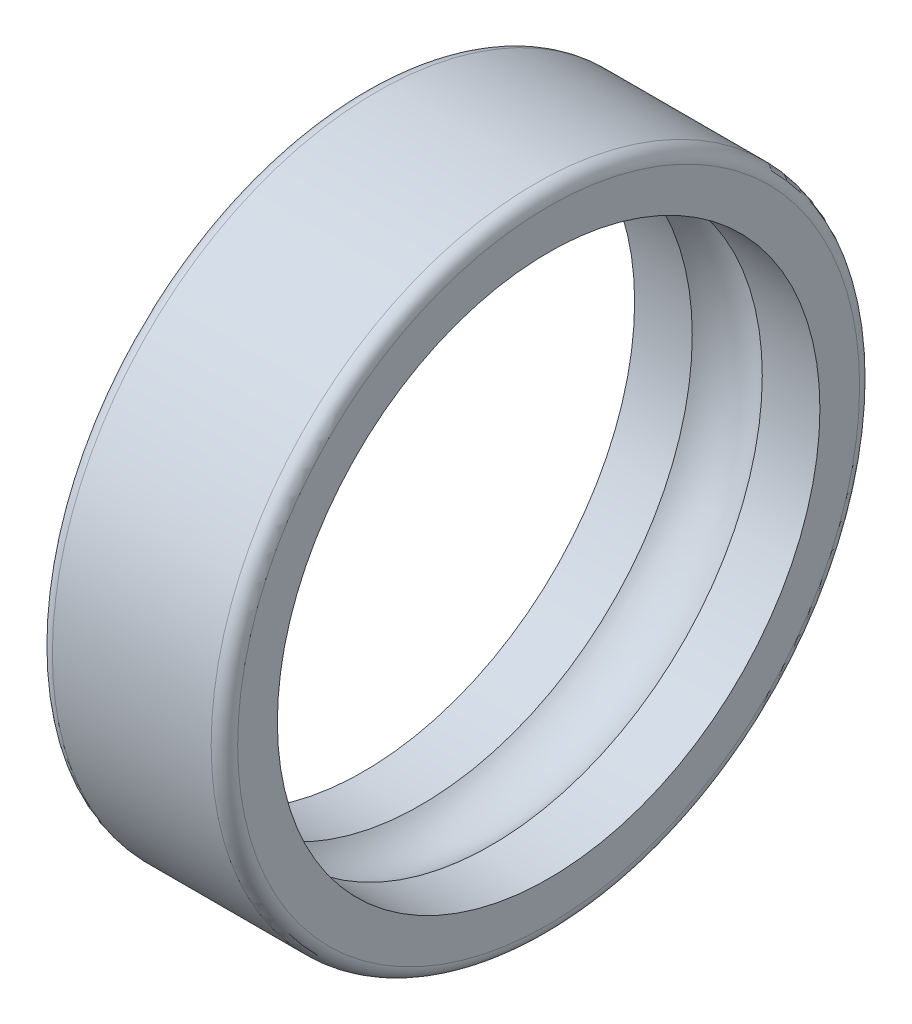
ISO-10303-21;
HEADER;
FILE_DESCRIPTION(('STEP AP214'),'2;1');
FILE_NAME('part.step','',(''),(''),'','','');
FILE_SCHEMA(('AUTOMOTIVE_DESIGN { 1 0 10303 214 1 1 1 1 }'));
ENDSEC;
DATA;
#1=APPLICATION_CONTEXT('core data for automotive mechanical design processes');
#2=APPLICATION_PROTOCOL_DEFINITION('international standard','automotive_design',2000,#1);
#3=PRODUCT_CONTEXT('',#1,'mechanical');
#4=PRODUCT('Part','Part','',(#3));
#5=PRODUCT_RELATED_PRODUCT_CATEGORY('part','',(#4));
#6=PRODUCT_DEFINITION_FORMATION('','',#4);
#7=PRODUCT_DEFINITION_CONTEXT('part definition',#1,'design');
#8=PRODUCT_DEFINITION('design','',#6,#7);
#9=PRODUCT_DEFINITION_SHAPE('','',#8);
#10=(LENGTH_UNIT() NAMED_UNIT(*) SI_UNIT(.MILLI.,.METRE.));
#11=(NAMED_UNIT(*) PLANE_ANGLE_UNIT() SI_UNIT($,.RADIAN.));
#12=(NAMED_UNIT(*) SI_UNIT($,.STERADIAN.) SOLID_ANGLE_UNIT());
#13=UNCERTAINTY_MEASURE_WITH_UNIT(LENGTH_MEASURE(1.E-05),#10,'distance_accuracy_value','');
#14=(GEOMETRIC_REPRESENTATION_CONTEXT(3) GLOBAL_UNCERTAINTY_ASSIGNED_CONTEXT((#13)) GLOBAL_UNIT_ASSIGNED_CONTEXT((#10,
#11,#12)) REPRESENTATION_CONTEXT('',''));
#15=CARTESIAN_POINT('',(0.,0.,0.));
#16=DIRECTION('',(0.,0.,1.));
#17=DIRECTION('',(1.,0.,0.));
#18=AXIS2_PLACEMENT_3D('',#15,#16,#17);
#19=CARTESIAN_POINT('',(0.,0.,0.));
#20=DIRECTION('',(-1.,0.,0.));
#21=DIRECTION('',(0.,0.,1.));
#22=AXIS2_PLACEMENT_3D('',#19,#20,#21);
#23=CYLINDRICAL_SURFACE('',#22,11.7142857142857);
#24=CARTESIAN_POINT('',(4.,0.,0.));
#25=DIRECTION('',(-1.,0.,0.));
#26=DIRECTION('',(0.,0.,1.));
#27=AXIS2_PLACEMENT_3D('',#24,#25,#26);
#28=CIRCLE('',#27,11.7142857142857);
#29=CARTESIAN_POINT('',(4.,0.,11.7142857142857));
#30=VERTEX_POINT('',#29);
#31=EDGE_CURVE('E376',#30,#30,#28,.T.);
#32=ORIENTED_EDGE('',*,*,#31,.F.);
#33=EDGE_LOOP('',(#32));
#34=FACE_BOUND('',#33,.T.);
#35=CARTESIAN_POINT('',(1.51185789203691,0.,0.));
#36=DIRECTION('',(-1.,0.,0.));
#37=DIRECTION('',(0.,0.,1.));
#38=AXIS2_PLACEMENT_3D('',#35,#36,#37);
#39=CIRCLE('',#38,11.7142857142857);
#40=CARTESIAN_POINT('',(1.51185789203691,0.,11.7142857142857));
#41=VERTEX_POINT('',#40);
#42=EDGE_CURVE('E10',#41,#41,#39,.T.);
#43=ORIENTED_EDGE('',*,*,#42,.T.);
#44=EDGE_LOOP('',(#43));
#45=FACE_BOUND('',#44,.T.);
#46=ADVANCED_FACE('F348',(#34,#45),#23,.F.);
#47=CARTESIAN_POINT('',(0.,0.,0.));
#48=DIRECTION('',(-1.,0.,0.));
#49=DIRECTION('',(0.,0.,1.));
#50=AXIS2_PLACEMENT_3D('',#47,#48,#49);
#51=TOROIDAL_SURFACE('',#50,10.,2.28571428571429);
#52=ORIENTED_EDGE('',*,*,#42,.F.);
#53=EDGE_LOOP('',(#52));
#54=FACE_BOUND('',#53,.T.);
#55=CARTESIAN_POINT('',(-1.51185789203691,0.,0.));
#56=DIRECTION('',(-1.,0.,0.));
#57=DIRECTION('',(0.,0.,1.));
#58=AXIS2_PLACEMENT_3D('',#55,#56,#57);
#59=CIRCLE('',#58,11.7142857142857);
#60=CARTESIAN_POINT('',(-1.51185789203691,0.,11.7142857142857));
#61=VERTEX_POINT('',#60);
#62=EDGE_CURVE('E354',#61,#61,#59,.T.);
#63=ORIENTED_EDGE('',*,*,#62,.T.);
#64=EDGE_LOOP('',(#63));
#65=FACE_BOUND('',#64,.T.);
#66=ADVANCED_FACE('F383',(#54,#65),#51,.F.);
#67=CARTESIAN_POINT('',(0.,0.,0.));
#68=DIRECTION('',(-1.,0.,0.));
#69=DIRECTION('',(0.,0.,1.));
#70=AXIS2_PLACEMENT_3D('',#67,#68,#69);
#71=CYLINDRICAL_SURFACE('',#70,11.7142857142857);
#72=ORIENTED_EDGE('',*,*,#62,.F.);
#73=EDGE_LOOP('',(#72));
#74=FACE_BOUND('',#73,.T.);
#75=CARTESIAN_POINT('',(-4.,0.,0.));
#76=DIRECTION('',(-1.,0.,0.));
#77=DIRECTION('',(0.,0.,1.));
#78=AXIS2_PLACEMENT_3D('',#75,#76,#77);
#79=CIRCLE('',#78,11.7142857142857);
#80=CARTESIAN_POINT('',(-4.,0.,11.7142857142857));
#81=VERTEX_POINT('',#80);
#82=EDGE_CURVE('E358',#81,#81,#79,.T.);
#83=ORIENTED_EDGE('',*,*,#82,.T.);
#84=EDGE_LOOP('',(#83));
#85=FACE_BOUND('',#84,.T.);
#86=ADVANCED_FACE('F387',(#74,#85),#71,.F.);
#87=CARTESIAN_POINT('',(-4.,13.4285714285714,0.));
#88=DIRECTION('',(1.,0.,0.));
#89=DIRECTION('',(0.,0.,-1.));
#90=AXIS2_PLACEMENT_3D('',#87,#88,#89);
#91=PLANE('',#90);
#92=ORIENTED_EDGE('',*,*,#82,.F.);
#93=EDGE_LOOP('',(#92));
#94=FACE_BOUND('',#93,.T.);
#95=CARTESIAN_POINT('',(-4.,0.,0.));
#96=DIRECTION('',(-1.,0.,0.));
#97=DIRECTION('',(0.,0.,1.));
#98=AXIS2_PLACEMENT_3D('',#95,#96,#97);
#99=CIRCLE('',#98,13.4285714285714);
#100=CARTESIAN_POINT('',(-4.,0.,13.4285714285714));
#101=VERTEX_POINT('',#100);
#102=EDGE_CURVE('E362',#101,#101,#99,.T.);
#103=ORIENTED_EDGE('',*,*,#102,.T.);
#104=EDGE_LOOP('',(#103));
#105=FACE_BOUND('',#104,.T.);
#106=ADVANCED_FACE('F392',(#94,#105),#91,.F.);
#107=CARTESIAN_POINT('',(-3.42857142857143,0.,0.));
#108=DIRECTION('',(-1.,0.,0.));
#109=DIRECTION('',(0.,0.,1.));
#110=AXIS2_PLACEMENT_3D('',#107,#108,#109);
#111=TOROIDAL_SURFACE('',#110,13.4285714285714,0.571428571428572);
#112=ORIENTED_EDGE('',*,*,#102,.F.);
#113=EDGE_LOOP('',(#112));
#114=FACE_BOUND('',#113,.T.);
#115=CARTESIAN_POINT('',(-3.42857142857143,0.,0.));
#116=DIRECTION('',(-1.,0.,0.));
#117=DIRECTION('',(0.,0.,1.));
#118=AXIS2_PLACEMENT_3D('',#115,#116,#117);
#119=CIRCLE('',#118,14.);
#120=CARTESIAN_POINT('',(-3.42857142857143,0.,14.));
#121=VERTEX_POINT('',#120);
#122=EDGE_CURVE('E367',#121,#121,#119,.T.);
#123=ORIENTED_EDGE('',*,*,#122,.T.);
#124=EDGE_LOOP('',(#123));
#125=FACE_BOUND('',#124,.T.);
#126=ADVANCED_FACE('F398',(#114,#125),#111,.T.);
#127=CARTESIAN_POINT('',(0.,0.,0.));
#128=DIRECTION('',(-1.,0.,0.));
#129=DIRECTION('',(0.,0.,1.));
#130=AXIS2_PLACEMENT_3D('',#127,#128,#129);
#131=CYLINDRICAL_SURFACE('',#130,14.);
#132=ORIENTED_EDGE('',*,*,#122,.F.);
#133=EDGE_LOOP('',(#132));
#134=FACE_BOUND('',#133,.T.);
#135=CARTESIAN_POINT('',(3.42857142857143,0.,0.));
#136=DIRECTION('',(-1.,0.,0.));
#137=DIRECTION('',(0.,0.,1.));
#138=AXIS2_PLACEMENT_3D('',#135,#136,#137);
#139=CIRCLE('',#138,14.);
#140=CARTESIAN_POINT('',(3.42857142857143,0.,14.));
#141=VERTEX_POINT('',#140);
#142=EDGE_CURVE('E370',#141,#141,#139,.T.);
#143=ORIENTED_EDGE('',*,*,#142,.T.);
#144=EDGE_LOOP('',(#143));
#145=FACE_BOUND('',#144,.T.);
#146=ADVANCED_FACE('F402',(#134,#145),#131,.T.);
#147=CARTESIAN_POINT('',(3.42857142857143,0.,0.));
#148=DIRECTION('',(-1.,0.,0.));
#149=DIRECTION('',(0.,0.,1.));
#150=AXIS2_PLACEMENT_3D('',#147,#148,#149);
#151=TOROIDAL_SURFACE('',#150,13.4285714285714,0.571428571428573);
#152=ORIENTED_EDGE('',*,*,#142,.F.);
#153=EDGE_LOOP('',(#152));
#154=FACE_BOUND('',#153,.T.);
#155=CARTESIAN_POINT('',(4.,0.,0.));
#156=DIRECTION('',(-1.,0.,0.));
#157=DIRECTION('',(0.,0.,1.));
#158=AXIS2_PLACEMENT_3D('',#155,#156,#157);
#159=CIRCLE('',#158,13.4285714285714);
#160=CARTESIAN_POINT('',(4.,0.,13.4285714285714));
#161=VERTEX_POINT('',#160);
#162=EDGE_CURVE('E373',#161,#161,#159,.T.);
#163=ORIENTED_EDGE('',*,*,#162,.T.);
#164=EDGE_LOOP('',(#163));
#165=FACE_BOUND('',#164,.T.);
#166=ADVANCED_FACE('F406',(#154,#165),#151,.T.);
#167=CARTESIAN_POINT('',(4.,13.4285714285714,0.));
#168=DIRECTION('',(-1.,0.,0.));
#169=DIRECTION('',(0.,0.,1.));
#170=AXIS2_PLACEMENT_3D('',#167,#168,#169);
#171=PLANE('',#170);
#172=ORIENTED_EDGE('',*,*,#162,.F.);
#173=EDGE_LOOP('',(#172));
#174=FACE_BOUND('',#173,.T.);
#175=ORIENTED_EDGE('',*,*,#31,.T.);
#176=EDGE_LOOP('',(#175));
#177=FACE_BOUND('',#176,.T.);
#178=ADVANCED_FACE('F380',(#174,#177),#171,.F.);
#179=CLOSED_SHELL('',(#46,#66,#86,#106,#126,#146,#166,#178));
#180=MANIFOLD_SOLID_BREP('B2',#179);
#181=ADVANCED_BREP_SHAPE_REPRESENTATION('',(#18,#180),#14);
#182=SHAPE_DEFINITION_REPRESENTATION(#9,#181);
ENDSEC;
END-ISO-10303-21;
